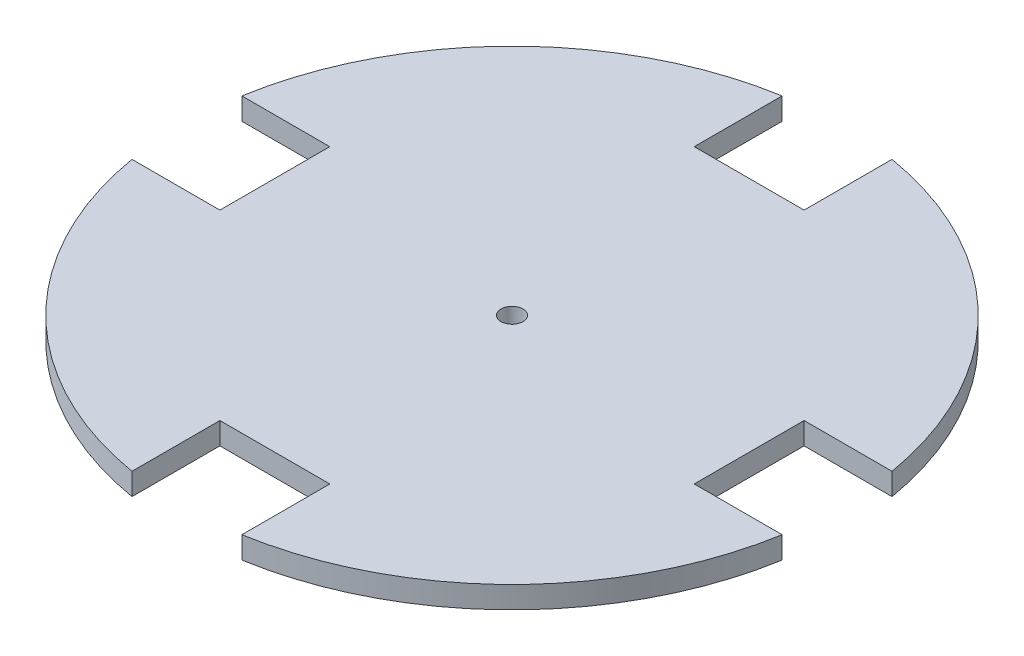
ISO-10303-21;
HEADER;
FILE_DESCRIPTION(('STEP AP214'),'2;1');
FILE_NAME('part.step','',(''),(''),'','','');
FILE_SCHEMA(('AUTOMOTIVE_DESIGN { 1 0 10303 214 1 1 1 1 }'));
ENDSEC;
DATA;
#1=APPLICATION_CONTEXT('core data for automotive mechanical design processes');
#2=APPLICATION_PROTOCOL_DEFINITION('international standard','automotive_design',2000,#1);
#3=PRODUCT_CONTEXT('',#1,'mechanical');
#4=PRODUCT('Part','Part','',(#3));
#5=PRODUCT_RELATED_PRODUCT_CATEGORY('part','',(#4));
#6=PRODUCT_DEFINITION_FORMATION('','',#4);
#7=PRODUCT_DEFINITION_CONTEXT('part definition',#1,'design');
#8=PRODUCT_DEFINITION('design','',#6,#7);
#9=PRODUCT_DEFINITION_SHAPE('','',#8);
#10=(LENGTH_UNIT() NAMED_UNIT(*) SI_UNIT(.MILLI.,.METRE.));
#11=(NAMED_UNIT(*) PLANE_ANGLE_UNIT() SI_UNIT($,.RADIAN.));
#12=(NAMED_UNIT(*) SI_UNIT($,.STERADIAN.) SOLID_ANGLE_UNIT());
#13=UNCERTAINTY_MEASURE_WITH_UNIT(LENGTH_MEASURE(1.E-05),#10,'distance_accuracy_value','');
#14=(GEOMETRIC_REPRESENTATION_CONTEXT(3) GLOBAL_UNCERTAINTY_ASSIGNED_CONTEXT((#13)) GLOBAL_UNIT_ASSIGNED_CONTEXT((#10,
#11,#12)) REPRESENTATION_CONTEXT('',''));
#15=CARTESIAN_POINT('',(0.,0.,0.));
#16=DIRECTION('',(0.,0.,1.));
#17=DIRECTION('',(1.,0.,0.));
#18=AXIS2_PLACEMENT_3D('',#15,#16,#17);
#19=CARTESIAN_POINT('',(0.,5.,0.));
#20=DIRECTION('',(0.,1.,0.));
#21=DIRECTION('',(0.,0.,1.));
#22=AXIS2_PLACEMENT_3D('',#19,#20,#21);
#23=PLANE('',#22);
#24=CARTESIAN_POINT('',(0.,5.,0.));
#25=DIRECTION('',(0.,1.,0.));
#26=DIRECTION('',(0.,0.,1.));
#27=AXIS2_PLACEMENT_3D('',#24,#25,#26);
#28=CIRCLE('',#27,150.);
#29=CARTESIAN_POINT('',(147.90199457749,5.,-25.));
#30=VERTEX_POINT('',#29);
#31=CARTESIAN_POINT('',(25.,5.,-147.90199457749));
#32=VERTEX_POINT('',#31);
#33=EDGE_CURVE('E217',#30,#32,#28,.T.);
#34=ORIENTED_EDGE('',*,*,#33,.T.);
#35=DIRECTION('',(0.,0.,1.));
#36=VECTOR('',#35,1.);
#37=CARTESIAN_POINT('',(25.,5.,-107.90199457749));
#38=LINE('',#37,#36);
#39=CARTESIAN_POINT('',(25.,5.,-107.90199457749));
#40=VERTEX_POINT('',#39);
#41=EDGE_CURVE('E125',#32,#40,#38,.T.);
#42=ORIENTED_EDGE('',*,*,#41,.T.);
#43=DIRECTION('',(-1.,0.,0.));
#44=VECTOR('',#43,1.);
#45=CARTESIAN_POINT('',(-25.,5.,-107.90199457749));
#46=LINE('',#45,#44);
#47=CARTESIAN_POINT('',(-25.,5.,-107.90199457749));
#48=VERTEX_POINT('',#47);
#49=EDGE_CURVE('E256',#40,#48,#46,.T.);
#50=ORIENTED_EDGE('',*,*,#49,.T.);
#51=DIRECTION('',(0.,0.,-1.));
#52=VECTOR('',#51,1.);
#53=CARTESIAN_POINT('',(-25.,5.,-107.90199457749));
#54=LINE('',#53,#52);
#55=CARTESIAN_POINT('',(-25.,5.,-147.90199457749));
#56=VERTEX_POINT('',#55);
#57=EDGE_CURVE('E275',#48,#56,#54,.T.);
#58=ORIENTED_EDGE('',*,*,#57,.T.);
#59=CARTESIAN_POINT('',(0.,5.,0.));
#60=DIRECTION('',(0.,1.,0.));
#61=DIRECTION('',(0.,0.,1.));
#62=AXIS2_PLACEMENT_3D('',#59,#60,#61);
#63=CIRCLE('',#62,150.);
#64=CARTESIAN_POINT('',(-147.90199457749,5.,-25.));
#65=VERTEX_POINT('',#64);
#66=EDGE_CURVE('E272',#56,#65,#63,.T.);
#67=ORIENTED_EDGE('',*,*,#66,.T.);
#68=DIRECTION('',(1.,0.,0.));
#69=VECTOR('',#68,1.);
#70=CARTESIAN_POINT('',(-107.90199457749,5.,-25.));
#71=LINE('',#70,#69);
#72=CARTESIAN_POINT('',(-107.90199457749,5.,-25.));
#73=VERTEX_POINT('',#72);
#74=EDGE_CURVE('E274',#65,#73,#71,.T.);
#75=ORIENTED_EDGE('',*,*,#74,.T.);
#76=DIRECTION('',(0.,0.,1.));
#77=VECTOR('',#76,1.);
#78=CARTESIAN_POINT('',(-107.90199457749,5.,25.));
#79=LINE('',#78,#77);
#80=CARTESIAN_POINT('',(-107.90199457749,5.,25.));
#81=VERTEX_POINT('',#80);
#82=EDGE_CURVE('E277',#73,#81,#79,.T.);
#83=ORIENTED_EDGE('',*,*,#82,.T.);
#84=DIRECTION('',(-1.,0.,0.));
#85=VECTOR('',#84,1.);
#86=CARTESIAN_POINT('',(-107.90199457749,5.,25.));
#87=LINE('',#86,#85);
#88=CARTESIAN_POINT('',(-147.90199457749,5.,25.));
#89=VERTEX_POINT('',#88);
#90=EDGE_CURVE('E283',#81,#89,#87,.T.);
#91=ORIENTED_EDGE('',*,*,#90,.T.);
#92=CARTESIAN_POINT('',(0.,5.,0.));
#93=DIRECTION('',(0.,1.,0.));
#94=DIRECTION('',(0.,0.,1.));
#95=AXIS2_PLACEMENT_3D('',#92,#93,#94);
#96=CIRCLE('',#95,150.);
#97=CARTESIAN_POINT('',(-25.,5.,147.90199457749));
#98=VERTEX_POINT('',#97);
#99=EDGE_CURVE('E285',#89,#98,#96,.T.);
#100=ORIENTED_EDGE('',*,*,#99,.T.);
#101=DIRECTION('',(0.,0.,-1.));
#102=VECTOR('',#101,1.);
#103=CARTESIAN_POINT('',(-25.,5.,107.90199457749));
#104=LINE('',#103,#102);
#105=CARTESIAN_POINT('',(-25.,5.,107.90199457749));
#106=VERTEX_POINT('',#105);
#107=EDGE_CURVE('E287',#98,#106,#104,.T.);
#108=ORIENTED_EDGE('',*,*,#107,.T.);
#109=DIRECTION('',(1.,0.,0.));
#110=VECTOR('',#109,1.);
#111=CARTESIAN_POINT('',(25.,5.,107.90199457749));
#112=LINE('',#111,#110);
#113=CARTESIAN_POINT('',(25.,5.,107.90199457749));
#114=VERTEX_POINT('',#113);
#115=EDGE_CURVE('E289',#106,#114,#112,.T.);
#116=ORIENTED_EDGE('',*,*,#115,.T.);
#117=DIRECTION('',(0.,0.,1.));
#118=VECTOR('',#117,1.);
#119=CARTESIAN_POINT('',(25.,5.,107.90199457749));
#120=LINE('',#119,#118);
#121=CARTESIAN_POINT('',(25.,5.,147.90199457749));
#122=VERTEX_POINT('',#121);
#123=EDGE_CURVE('E291',#114,#122,#120,.T.);
#124=ORIENTED_EDGE('',*,*,#123,.T.);
#125=CARTESIAN_POINT('',(0.,5.,0.));
#126=DIRECTION('',(0.,1.,0.));
#127=DIRECTION('',(0.,0.,1.));
#128=AXIS2_PLACEMENT_3D('',#125,#126,#127);
#129=CIRCLE('',#128,150.);
#130=CARTESIAN_POINT('',(147.90199457749,5.,25.));
#131=VERTEX_POINT('',#130);
#132=EDGE_CURVE('E168',#122,#131,#129,.T.);
#133=ORIENTED_EDGE('',*,*,#132,.T.);
#134=DIRECTION('',(-1.,0.,0.));
#135=VECTOR('',#134,1.);
#136=CARTESIAN_POINT('',(107.90199457749,5.,25.));
#137=LINE('',#136,#135);
#138=CARTESIAN_POINT('',(107.90199457749,5.,25.));
#139=VERTEX_POINT('',#138);
#140=EDGE_CURVE('E162',#131,#139,#137,.T.);
#141=ORIENTED_EDGE('',*,*,#140,.T.);
#142=DIRECTION('',(0.,0.,-1.));
#143=VECTOR('',#142,1.);
#144=CARTESIAN_POINT('',(107.90199457749,5.,-25.));
#145=LINE('',#144,#143);
#146=CARTESIAN_POINT('',(107.90199457749,5.,-25.));
#147=VERTEX_POINT('',#146);
#148=EDGE_CURVE('E166',#139,#147,#145,.T.);
#149=ORIENTED_EDGE('',*,*,#148,.T.);
#150=DIRECTION('',(1.,0.,0.));
#151=VECTOR('',#150,1.);
#152=CARTESIAN_POINT('',(107.90199457749,5.,-25.));
#153=LINE('',#152,#151);
#154=EDGE_CURVE('E58',#147,#30,#153,.T.);
#155=ORIENTED_EDGE('',*,*,#154,.T.);
#156=EDGE_LOOP('',(#34,#42,#50,#58,#67,#75,#83,#91,#100,#108,#116,#124,#133,#141,#149,#155));
#157=FACE_BOUND('',#156,.T.);
#158=CARTESIAN_POINT('',(0.,5.,0.));
#159=DIRECTION('',(0.,1.,0.));
#160=DIRECTION('',(0.,0.,1.));
#161=AXIS2_PLACEMENT_3D('',#158,#159,#160);
#162=CIRCLE('',#161,5.);
#163=CARTESIAN_POINT('',(0.,5.,5.));
#164=VERTEX_POINT('',#163);
#165=EDGE_CURVE('E190',#164,#164,#162,.T.);
#166=ORIENTED_EDGE('',*,*,#165,.F.);
#167=EDGE_LOOP('',(#166));
#168=FACE_BOUND('',#167,.T.);
#169=ADVANCED_FACE('F41',(#157,#168),#23,.T.);
#170=CARTESIAN_POINT('',(0.,-5.,0.));
#171=DIRECTION('',(0.,1.,0.));
#172=DIRECTION('',(0.,0.,1.));
#173=AXIS2_PLACEMENT_3D('',#170,#171,#172);
#174=PLANE('',#173);
#175=CARTESIAN_POINT('',(0.,-5.,0.));
#176=DIRECTION('',(0.,1.,0.));
#177=DIRECTION('',(0.,0.,1.));
#178=AXIS2_PLACEMENT_3D('',#175,#176,#177);
#179=CIRCLE('',#178,150.);
#180=CARTESIAN_POINT('',(147.90199457749,-5.,-25.));
#181=VERTEX_POINT('',#180);
#182=CARTESIAN_POINT('',(25.,-5.,-147.90199457749));
#183=VERTEX_POINT('',#182);
#184=EDGE_CURVE('E186',#181,#183,#179,.T.);
#185=ORIENTED_EDGE('',*,*,#184,.F.);
#186=DIRECTION('',(1.,0.,0.));
#187=VECTOR('',#186,1.);
#188=CARTESIAN_POINT('',(107.90199457749,-5.,-25.));
#189=LINE('',#188,#187);
#190=CARTESIAN_POINT('',(107.90199457749,-5.,-25.));
#191=VERTEX_POINT('',#190);
#192=EDGE_CURVE('E117',#191,#181,#189,.T.);
#193=ORIENTED_EDGE('',*,*,#192,.F.);
#194=DIRECTION('',(0.,0.,-1.));
#195=VECTOR('',#194,1.);
#196=CARTESIAN_POINT('',(107.90199457749,-5.,-25.));
#197=LINE('',#196,#195);
#198=CARTESIAN_POINT('',(107.90199457749,-5.,25.));
#199=VERTEX_POINT('',#198);
#200=EDGE_CURVE('E111',#199,#191,#197,.T.);
#201=ORIENTED_EDGE('',*,*,#200,.F.);
#202=DIRECTION('',(-1.,0.,0.));
#203=VECTOR('',#202,1.);
#204=CARTESIAN_POINT('',(107.90199457749,-5.,25.));
#205=LINE('',#204,#203);
#206=CARTESIAN_POINT('',(147.90199457749,-5.,25.));
#207=VERTEX_POINT('',#206);
#208=EDGE_CURVE('E176',#207,#199,#205,.T.);
#209=ORIENTED_EDGE('',*,*,#208,.F.);
#210=CARTESIAN_POINT('',(0.,-5.,0.));
#211=DIRECTION('',(0.,1.,0.));
#212=DIRECTION('',(0.,0.,1.));
#213=AXIS2_PLACEMENT_3D('',#210,#211,#212);
#214=CIRCLE('',#213,150.);
#215=CARTESIAN_POINT('',(25.,-5.,147.90199457749));
#216=VERTEX_POINT('',#215);
#217=EDGE_CURVE('E212',#216,#207,#214,.T.);
#218=ORIENTED_EDGE('',*,*,#217,.F.);
#219=DIRECTION('',(0.,0.,1.));
#220=VECTOR('',#219,1.);
#221=CARTESIAN_POINT('',(25.,-5.,107.90199457749));
#222=LINE('',#221,#220);
#223=CARTESIAN_POINT('',(25.,-5.,107.90199457749));
#224=VERTEX_POINT('',#223);
#225=EDGE_CURVE('E210',#224,#216,#222,.T.);
#226=ORIENTED_EDGE('',*,*,#225,.F.);
#227=DIRECTION('',(1.,0.,0.));
#228=VECTOR('',#227,1.);
#229=CARTESIAN_POINT('',(25.,-5.,107.90199457749));
#230=LINE('',#229,#228);
#231=CARTESIAN_POINT('',(-25.,-5.,107.90199457749));
#232=VERTEX_POINT('',#231);
#233=EDGE_CURVE('E208',#232,#224,#230,.T.);
#234=ORIENTED_EDGE('',*,*,#233,.F.);
#235=DIRECTION('',(0.,0.,-1.));
#236=VECTOR('',#235,1.);
#237=CARTESIAN_POINT('',(-25.,-5.,107.90199457749));
#238=LINE('',#237,#236);
#239=CARTESIAN_POINT('',(-25.,-5.,147.90199457749));
#240=VERTEX_POINT('',#239);
#241=EDGE_CURVE('E206',#240,#232,#238,.T.);
#242=ORIENTED_EDGE('',*,*,#241,.F.);
#243=CARTESIAN_POINT('',(0.,-5.,0.));
#244=DIRECTION('',(0.,1.,0.));
#245=DIRECTION('',(0.,0.,1.));
#246=AXIS2_PLACEMENT_3D('',#243,#244,#245);
#247=CIRCLE('',#246,150.);
#248=CARTESIAN_POINT('',(-147.90199457749,-5.,25.));
#249=VERTEX_POINT('',#248);
#250=EDGE_CURVE('E204',#249,#240,#247,.T.);
#251=ORIENTED_EDGE('',*,*,#250,.F.);
#252=DIRECTION('',(-1.,0.,0.));
#253=VECTOR('',#252,1.);
#254=CARTESIAN_POINT('',(-107.90199457749,-5.,25.));
#255=LINE('',#254,#253);
#256=CARTESIAN_POINT('',(-107.90199457749,-5.,25.));
#257=VERTEX_POINT('',#256);
#258=EDGE_CURVE('E202',#257,#249,#255,.T.);
#259=ORIENTED_EDGE('',*,*,#258,.F.);
#260=DIRECTION('',(0.,0.,1.));
#261=VECTOR('',#260,1.);
#262=CARTESIAN_POINT('',(-107.90199457749,-5.,25.));
#263=LINE('',#262,#261);
#264=CARTESIAN_POINT('',(-107.90199457749,-5.,-25.));
#265=VERTEX_POINT('',#264);
#266=EDGE_CURVE('E200',#265,#257,#263,.T.);
#267=ORIENTED_EDGE('',*,*,#266,.F.);
#268=DIRECTION('',(1.,0.,0.));
#269=VECTOR('',#268,1.);
#270=CARTESIAN_POINT('',(-107.90199457749,-5.,-25.));
#271=LINE('',#270,#269);
#272=CARTESIAN_POINT('',(-147.90199457749,-5.,-25.));
#273=VERTEX_POINT('',#272);
#274=EDGE_CURVE('E198',#273,#265,#271,.T.);
#275=ORIENTED_EDGE('',*,*,#274,.F.);
#276=CARTESIAN_POINT('',(0.,-5.,0.));
#277=DIRECTION('',(0.,1.,0.));
#278=DIRECTION('',(0.,0.,1.));
#279=AXIS2_PLACEMENT_3D('',#276,#277,#278);
#280=CIRCLE('',#279,150.);
#281=CARTESIAN_POINT('',(-25.,-5.,-147.90199457749));
#282=VERTEX_POINT('',#281);
#283=EDGE_CURVE('E196',#282,#273,#280,.T.);
#284=ORIENTED_EDGE('',*,*,#283,.F.);
#285=DIRECTION('',(0.,0.,-1.));
#286=VECTOR('',#285,1.);
#287=CARTESIAN_POINT('',(-25.,-5.,-107.90199457749));
#288=LINE('',#287,#286);
#289=CARTESIAN_POINT('',(-25.,-5.,-107.90199457749));
#290=VERTEX_POINT('',#289);
#291=EDGE_CURVE('E194',#290,#282,#288,.T.);
#292=ORIENTED_EDGE('',*,*,#291,.F.);
#293=DIRECTION('',(-1.,0.,0.));
#294=VECTOR('',#293,1.);
#295=CARTESIAN_POINT('',(-25.,-5.,-107.90199457749));
#296=LINE('',#295,#294);
#297=CARTESIAN_POINT('',(25.,-5.,-107.90199457749));
#298=VERTEX_POINT('',#297);
#299=EDGE_CURVE('E192',#298,#290,#296,.T.);
#300=ORIENTED_EDGE('',*,*,#299,.F.);
#301=DIRECTION('',(0.,0.,1.));
#302=VECTOR('',#301,1.);
#303=CARTESIAN_POINT('',(25.,-5.,-107.90199457749));
#304=LINE('',#303,#302);
#305=EDGE_CURVE('E189',#183,#298,#304,.T.);
#306=ORIENTED_EDGE('',*,*,#305,.F.);
#307=EDGE_LOOP('',(#185,#193,#201,#209,#218,#226,#234,#242,#251,#259,#267,#275,#284,#292,#300,#306));
#308=FACE_BOUND('',#307,.T.);
#309=CARTESIAN_POINT('',(0.,-5.,0.));
#310=DIRECTION('',(0.,1.,0.));
#311=DIRECTION('',(0.,0.,1.));
#312=AXIS2_PLACEMENT_3D('',#309,#310,#311);
#313=CIRCLE('',#312,5.);
#314=CARTESIAN_POINT('',(0.,-5.,5.));
#315=VERTEX_POINT('',#314);
#316=EDGE_CURVE('E490',#315,#315,#313,.T.);
#317=ORIENTED_EDGE('',*,*,#316,.T.);
#318=EDGE_LOOP('',(#317));
#319=FACE_BOUND('',#318,.T.);
#320=ADVANCED_FACE('F260',(#308,#319),#174,.F.);
#321=CARTESIAN_POINT('',(0.,5.,0.));
#322=DIRECTION('',(0.,-1.,0.));
#323=DIRECTION('',(0.,0.,-1.));
#324=AXIS2_PLACEMENT_3D('',#321,#322,#323);
#325=CYLINDRICAL_SURFACE('',#324,150.);
#326=ORIENTED_EDGE('',*,*,#184,.T.);
#327=DIRECTION('',(0.,-1.,0.));
#328=VECTOR('',#327,1.);
#329=CARTESIAN_POINT('',(25.,5.,-147.90199457749));
#330=LINE('',#329,#328);
#331=EDGE_CURVE('E11',#32,#183,#330,.T.);
#332=ORIENTED_EDGE('',*,*,#331,.F.);
#333=ORIENTED_EDGE('',*,*,#33,.F.);
#334=DIRECTION('',(0.,-1.,0.));
#335=VECTOR('',#334,1.);
#336=CARTESIAN_POINT('',(147.90199457749,5.,-25.));
#337=LINE('',#336,#335);
#338=EDGE_CURVE('E182',#30,#181,#337,.T.);
#339=ORIENTED_EDGE('',*,*,#338,.T.);
#340=EDGE_LOOP('',(#326,#332,#333,#339));
#341=FACE_BOUND('',#340,.T.);
#342=ADVANCED_FACE('F43',(#341),#325,.T.);
#343=CARTESIAN_POINT('',(25.,5.,-107.90199457749));
#344=DIRECTION('',(1.,0.,0.));
#345=DIRECTION('',(0.,0.,-1.));
#346=AXIS2_PLACEMENT_3D('',#343,#344,#345);
#347=PLANE('',#346);
#348=ORIENTED_EDGE('',*,*,#305,.T.);
#349=DIRECTION('',(0.,-1.,0.));
#350=VECTOR('',#349,1.);
#351=CARTESIAN_POINT('',(25.,5.,-107.90199457749));
#352=LINE('',#351,#350);
#353=EDGE_CURVE('E50',#40,#298,#352,.T.);
#354=ORIENTED_EDGE('',*,*,#353,.F.);
#355=ORIENTED_EDGE('',*,*,#41,.F.);
#356=ORIENTED_EDGE('',*,*,#331,.T.);
#357=EDGE_LOOP('',(#348,#354,#355,#356));
#358=FACE_BOUND('',#357,.T.);
#359=ADVANCED_FACE('F325',(#358),#347,.F.);
#360=CARTESIAN_POINT('',(-25.,5.,-107.90199457749));
#361=DIRECTION('',(0.,0.,1.));
#362=DIRECTION('',(1.,0.,0.));
#363=AXIS2_PLACEMENT_3D('',#360,#361,#362);
#364=PLANE('',#363);
#365=ORIENTED_EDGE('',*,*,#299,.T.);
#366=DIRECTION('',(0.,-1.,0.));
#367=VECTOR('',#366,1.);
#368=CARTESIAN_POINT('',(-25.,5.,-107.90199457749));
#369=LINE('',#368,#367);
#370=EDGE_CURVE('E248',#48,#290,#369,.T.);
#371=ORIENTED_EDGE('',*,*,#370,.F.);
#372=ORIENTED_EDGE('',*,*,#49,.F.);
#373=ORIENTED_EDGE('',*,*,#353,.T.);
#374=EDGE_LOOP('',(#365,#371,#372,#373));
#375=FACE_BOUND('',#374,.T.);
#376=ADVANCED_FACE('F254',(#375),#364,.F.);
#377=CARTESIAN_POINT('',(-25.,5.,-107.90199457749));
#378=DIRECTION('',(-1.,0.,0.));
#379=DIRECTION('',(0.,0.,1.));
#380=AXIS2_PLACEMENT_3D('',#377,#378,#379);
#381=PLANE('',#380);
#382=ORIENTED_EDGE('',*,*,#291,.T.);
#383=DIRECTION('',(0.,-1.,0.));
#384=VECTOR('',#383,1.);
#385=CARTESIAN_POINT('',(-25.,5.,-147.90199457749));
#386=LINE('',#385,#384);
#387=EDGE_CURVE('E245',#56,#282,#386,.T.);
#388=ORIENTED_EDGE('',*,*,#387,.F.);
#389=ORIENTED_EDGE('',*,*,#57,.F.);
#390=ORIENTED_EDGE('',*,*,#370,.T.);
#391=EDGE_LOOP('',(#382,#388,#389,#390));
#392=FACE_BOUND('',#391,.T.);
#393=ADVANCED_FACE('F266',(#392),#381,.F.);
#394=CARTESIAN_POINT('',(0.,5.,0.));
#395=DIRECTION('',(0.,-1.,0.));
#396=DIRECTION('',(0.,0.,-1.));
#397=AXIS2_PLACEMENT_3D('',#394,#395,#396);
#398=CYLINDRICAL_SURFACE('',#397,150.);
#399=ORIENTED_EDGE('',*,*,#283,.T.);
#400=DIRECTION('',(0.,-1.,0.));
#401=VECTOR('',#400,1.);
#402=CARTESIAN_POINT('',(-147.90199457749,5.,-25.));
#403=LINE('',#402,#401);
#404=EDGE_CURVE('E242',#65,#273,#403,.T.);
#405=ORIENTED_EDGE('',*,*,#404,.F.);
#406=ORIENTED_EDGE('',*,*,#66,.F.);
#407=ORIENTED_EDGE('',*,*,#387,.T.);
#408=EDGE_LOOP('',(#399,#405,#406,#407));
#409=FACE_BOUND('',#408,.T.);
#410=ADVANCED_FACE('F270',(#409),#398,.T.);
#411=CARTESIAN_POINT('',(-107.90199457749,5.,-25.));
#412=DIRECTION('',(0.,0.,-1.));
#413=DIRECTION('',(-1.,0.,0.));
#414=AXIS2_PLACEMENT_3D('',#411,#412,#413);
#415=PLANE('',#414);
#416=ORIENTED_EDGE('',*,*,#274,.T.);
#417=DIRECTION('',(0.,-1.,0.));
#418=VECTOR('',#417,1.);
#419=CARTESIAN_POINT('',(-107.90199457749,5.,-25.));
#420=LINE('',#419,#418);
#421=EDGE_CURVE('E239',#73,#265,#420,.T.);
#422=ORIENTED_EDGE('',*,*,#421,.F.);
#423=ORIENTED_EDGE('',*,*,#74,.F.);
#424=ORIENTED_EDGE('',*,*,#404,.T.);
#425=EDGE_LOOP('',(#416,#422,#423,#424));
#426=FACE_BOUND('',#425,.T.);
#427=ADVANCED_FACE('F338',(#426),#415,.F.);
#428=CARTESIAN_POINT('',(-107.90199457749,5.,25.));
#429=DIRECTION('',(1.,0.,0.));
#430=DIRECTION('',(0.,0.,-1.));
#431=AXIS2_PLACEMENT_3D('',#428,#429,#430);
#432=PLANE('',#431);
#433=ORIENTED_EDGE('',*,*,#266,.T.);
#434=DIRECTION('',(0.,-1.,0.));
#435=VECTOR('',#434,1.);
#436=CARTESIAN_POINT('',(-107.90199457749,5.,25.));
#437=LINE('',#436,#435);
#438=EDGE_CURVE('E236',#81,#257,#437,.T.);
#439=ORIENTED_EDGE('',*,*,#438,.F.);
#440=ORIENTED_EDGE('',*,*,#82,.F.);
#441=ORIENTED_EDGE('',*,*,#421,.T.);
#442=EDGE_LOOP('',(#433,#439,#440,#441));
#443=FACE_BOUND('',#442,.T.);
#444=ADVANCED_FACE('F341',(#443),#432,.F.);
#445=CARTESIAN_POINT('',(-107.90199457749,5.,25.));
#446=DIRECTION('',(0.,0.,1.));
#447=DIRECTION('',(1.,0.,0.));
#448=AXIS2_PLACEMENT_3D('',#445,#446,#447);
#449=PLANE('',#448);
#450=ORIENTED_EDGE('',*,*,#258,.T.);
#451=DIRECTION('',(0.,-1.,0.));
#452=VECTOR('',#451,1.);
#453=CARTESIAN_POINT('',(-147.90199457749,5.,25.));
#454=LINE('',#453,#452);
#455=EDGE_CURVE('E233',#89,#249,#454,.T.);
#456=ORIENTED_EDGE('',*,*,#455,.F.);
#457=ORIENTED_EDGE('',*,*,#90,.F.);
#458=ORIENTED_EDGE('',*,*,#438,.T.);
#459=EDGE_LOOP('',(#450,#456,#457,#458));
#460=FACE_BOUND('',#459,.T.);
#461=ADVANCED_FACE('F345',(#460),#449,.F.);
#462=CARTESIAN_POINT('',(0.,5.,0.));
#463=DIRECTION('',(0.,-1.,0.));
#464=DIRECTION('',(0.,0.,-1.));
#465=AXIS2_PLACEMENT_3D('',#462,#463,#464);
#466=CYLINDRICAL_SURFACE('',#465,150.);
#467=ORIENTED_EDGE('',*,*,#250,.T.);
#468=DIRECTION('',(0.,-1.,0.));
#469=VECTOR('',#468,1.);
#470=CARTESIAN_POINT('',(-25.,5.,147.90199457749));
#471=LINE('',#470,#469);
#472=EDGE_CURVE('E230',#98,#240,#471,.T.);
#473=ORIENTED_EDGE('',*,*,#472,.F.);
#474=ORIENTED_EDGE('',*,*,#99,.F.);
#475=ORIENTED_EDGE('',*,*,#455,.T.);
#476=EDGE_LOOP('',(#467,#473,#474,#475));
#477=FACE_BOUND('',#476,.T.);
#478=ADVANCED_FACE('F349',(#477),#466,.T.);
#479=CARTESIAN_POINT('',(-25.,5.,107.90199457749));
#480=DIRECTION('',(-1.,0.,0.));
#481=DIRECTION('',(0.,0.,1.));
#482=AXIS2_PLACEMENT_3D('',#479,#480,#481);
#483=PLANE('',#482);
#484=ORIENTED_EDGE('',*,*,#241,.T.);
#485=DIRECTION('',(0.,-1.,0.));
#486=VECTOR('',#485,1.);
#487=CARTESIAN_POINT('',(-25.,5.,107.90199457749));
#488=LINE('',#487,#486);
#489=EDGE_CURVE('E227',#106,#232,#488,.T.);
#490=ORIENTED_EDGE('',*,*,#489,.F.);
#491=ORIENTED_EDGE('',*,*,#107,.F.);
#492=ORIENTED_EDGE('',*,*,#472,.T.);
#493=EDGE_LOOP('',(#484,#490,#491,#492));
#494=FACE_BOUND('',#493,.T.);
#495=ADVANCED_FACE('F353',(#494),#483,.F.);
#496=CARTESIAN_POINT('',(25.,5.,107.90199457749));
#497=DIRECTION('',(0.,0.,-1.));
#498=DIRECTION('',(-1.,0.,0.));
#499=AXIS2_PLACEMENT_3D('',#496,#497,#498);
#500=PLANE('',#499);
#501=ORIENTED_EDGE('',*,*,#233,.T.);
#502=DIRECTION('',(0.,-1.,0.));
#503=VECTOR('',#502,1.);
#504=CARTESIAN_POINT('',(25.,5.,107.90199457749));
#505=LINE('',#504,#503);
#506=EDGE_CURVE('E224',#114,#224,#505,.T.);
#507=ORIENTED_EDGE('',*,*,#506,.F.);
#508=ORIENTED_EDGE('',*,*,#115,.F.);
#509=ORIENTED_EDGE('',*,*,#489,.T.);
#510=EDGE_LOOP('',(#501,#507,#508,#509));
#511=FACE_BOUND('',#510,.T.);
#512=ADVANCED_FACE('F357',(#511),#500,.F.);
#513=CARTESIAN_POINT('',(25.,5.,107.90199457749));
#514=DIRECTION('',(1.,0.,0.));
#515=DIRECTION('',(0.,0.,-1.));
#516=AXIS2_PLACEMENT_3D('',#513,#514,#515);
#517=PLANE('',#516);
#518=ORIENTED_EDGE('',*,*,#225,.T.);
#519=DIRECTION('',(0.,-1.,0.));
#520=VECTOR('',#519,1.);
#521=CARTESIAN_POINT('',(25.,5.,147.90199457749));
#522=LINE('',#521,#520);
#523=EDGE_CURVE('E221',#122,#216,#522,.T.);
#524=ORIENTED_EDGE('',*,*,#523,.F.);
#525=ORIENTED_EDGE('',*,*,#123,.F.);
#526=ORIENTED_EDGE('',*,*,#506,.T.);
#527=EDGE_LOOP('',(#518,#524,#525,#526));
#528=FACE_BOUND('',#527,.T.);
#529=ADVANCED_FACE('F297',(#528),#517,.F.);
#530=CARTESIAN_POINT('',(0.,5.,0.));
#531=DIRECTION('',(0.,-1.,0.));
#532=DIRECTION('',(0.,0.,-1.));
#533=AXIS2_PLACEMENT_3D('',#530,#531,#532);
#534=CYLINDRICAL_SURFACE('',#533,150.);
#535=ORIENTED_EDGE('',*,*,#217,.T.);
#536=DIRECTION('',(0.,-1.,0.));
#537=VECTOR('',#536,1.);
#538=CARTESIAN_POINT('',(147.90199457749,5.,25.));
#539=LINE('',#538,#537);
#540=EDGE_CURVE('E177',#131,#207,#539,.T.);
#541=ORIENTED_EDGE('',*,*,#540,.F.);
#542=ORIENTED_EDGE('',*,*,#132,.F.);
#543=ORIENTED_EDGE('',*,*,#523,.T.);
#544=EDGE_LOOP('',(#535,#541,#542,#543));
#545=FACE_BOUND('',#544,.T.);
#546=ADVANCED_FACE('F301',(#545),#534,.T.);
#547=CARTESIAN_POINT('',(107.90199457749,5.,25.));
#548=DIRECTION('',(0.,0.,1.));
#549=DIRECTION('',(1.,0.,0.));
#550=AXIS2_PLACEMENT_3D('',#547,#548,#549);
#551=PLANE('',#550);
#552=ORIENTED_EDGE('',*,*,#208,.T.);
#553=DIRECTION('',(0.,-1.,0.));
#554=VECTOR('',#553,1.);
#555=CARTESIAN_POINT('',(107.90199457749,5.,25.));
#556=LINE('',#555,#554);
#557=EDGE_CURVE('E173',#139,#199,#556,.T.);
#558=ORIENTED_EDGE('',*,*,#557,.F.);
#559=ORIENTED_EDGE('',*,*,#140,.F.);
#560=ORIENTED_EDGE('',*,*,#540,.T.);
#561=EDGE_LOOP('',(#552,#558,#559,#560));
#562=FACE_BOUND('',#561,.T.);
#563=ADVANCED_FACE('F174',(#562),#551,.F.);
#564=CARTESIAN_POINT('',(107.90199457749,5.,-25.));
#565=DIRECTION('',(-1.,0.,0.));
#566=DIRECTION('',(0.,0.,1.));
#567=AXIS2_PLACEMENT_3D('',#564,#565,#566);
#568=PLANE('',#567);
#569=ORIENTED_EDGE('',*,*,#200,.T.);
#570=DIRECTION('',(0.,-1.,0.));
#571=VECTOR('',#570,1.);
#572=CARTESIAN_POINT('',(107.90199457749,5.,-25.));
#573=LINE('',#572,#571);
#574=EDGE_CURVE('E178',#147,#191,#573,.T.);
#575=ORIENTED_EDGE('',*,*,#574,.F.);
#576=ORIENTED_EDGE('',*,*,#148,.F.);
#577=ORIENTED_EDGE('',*,*,#557,.T.);
#578=EDGE_LOOP('',(#569,#575,#576,#577));
#579=FACE_BOUND('',#578,.T.);
#580=ADVANCED_FACE('F180',(#579),#568,.F.);
#581=CARTESIAN_POINT('',(107.90199457749,5.,-25.));
#582=DIRECTION('',(0.,0.,-1.));
#583=DIRECTION('',(-1.,0.,0.));
#584=AXIS2_PLACEMENT_3D('',#581,#582,#583);
#585=PLANE('',#584);
#586=ORIENTED_EDGE('',*,*,#192,.T.);
#587=ORIENTED_EDGE('',*,*,#338,.F.);
#588=ORIENTED_EDGE('',*,*,#154,.F.);
#589=ORIENTED_EDGE('',*,*,#574,.T.);
#590=EDGE_LOOP('',(#586,#587,#588,#589));
#591=FACE_BOUND('',#590,.T.);
#592=ADVANCED_FACE('F305',(#591),#585,.F.);
#593=CARTESIAN_POINT('',(0.,5.,0.));
#594=DIRECTION('',(0.,-1.,0.));
#595=DIRECTION('',(0.,0.,-1.));
#596=AXIS2_PLACEMENT_3D('',#593,#594,#595);
#597=CYLINDRICAL_SURFACE('',#596,5.);
#598=ORIENTED_EDGE('',*,*,#165,.T.);
#599=EDGE_LOOP('',(#598));
#600=FACE_BOUND('',#599,.T.);
#601=ORIENTED_EDGE('',*,*,#316,.F.);
#602=EDGE_LOOP('',(#601));
#603=FACE_BOUND('',#602,.T.);
#604=ADVANCED_FACE('F307',(#600,#603),#597,.F.);
#605=CLOSED_SHELL('',(#169,#320,#342,#359,#376,#393,#410,#427,#444,#461,#478,#495,#512,#529,
#546,#563,#580,#592,#604));
#606=MANIFOLD_SOLID_BREP('B2',#605);
#607=ADVANCED_BREP_SHAPE_REPRESENTATION('',(#18,#606),#14);
#608=SHAPE_DEFINITION_REPRESENTATION(#9,#607);
ENDSEC;
END-ISO-10303-21;
